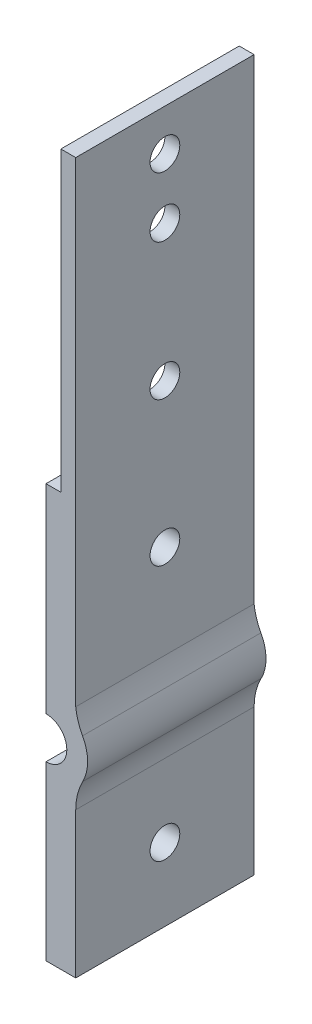
ISO-10303-21;
HEADER;
FILE_DESCRIPTION(('STEP AP214'),'2;1');
FILE_NAME('part.step','',(''),(''),'','','');
FILE_SCHEMA(('AUTOMOTIVE_DESIGN { 1 0 10303 214 1 1 1 1 }'));
ENDSEC;
DATA;
#1=APPLICATION_CONTEXT('core data for automotive mechanical design processes');
#2=APPLICATION_PROTOCOL_DEFINITION('international standard','automotive_design',2000,#1);
#3=PRODUCT_CONTEXT('',#1,'mechanical');
#4=PRODUCT('Part','Part','',(#3));
#5=PRODUCT_RELATED_PRODUCT_CATEGORY('part','',(#4));
#6=PRODUCT_DEFINITION_FORMATION('','',#4);
#7=PRODUCT_DEFINITION_CONTEXT('part definition',#1,'design');
#8=PRODUCT_DEFINITION('design','',#6,#7);
#9=PRODUCT_DEFINITION_SHAPE('','',#8);
#10=(LENGTH_UNIT() NAMED_UNIT(*) SI_UNIT(.MILLI.,.METRE.));
#11=(NAMED_UNIT(*) PLANE_ANGLE_UNIT() SI_UNIT($,.RADIAN.));
#12=(NAMED_UNIT(*) SI_UNIT($,.STERADIAN.) SOLID_ANGLE_UNIT());
#13=UNCERTAINTY_MEASURE_WITH_UNIT(LENGTH_MEASURE(1.E-05),#10,'distance_accuracy_value','');
#14=(GEOMETRIC_REPRESENTATION_CONTEXT(3) GLOBAL_UNCERTAINTY_ASSIGNED_CONTEXT((#13)) GLOBAL_UNIT_ASSIGNED_CONTEXT((#10,
#11,#12)) REPRESENTATION_CONTEXT('',''));
#15=CARTESIAN_POINT('',(0.,0.,0.));
#16=DIRECTION('',(0.,0.,1.));
#17=DIRECTION('',(1.,0.,0.));
#18=AXIS2_PLACEMENT_3D('',#15,#16,#17);
#19=CARTESIAN_POINT('',(0.,0.,30.));
#20=DIRECTION('',(0.,0.,-1.));
#21=DIRECTION('',(-1.,0.,0.));
#22=AXIS2_PLACEMENT_3D('',#19,#20,#21);
#23=CYLINDRICAL_SURFACE('',#22,7.);
#24=CARTESIAN_POINT('',(0.,0.,30.));
#25=DIRECTION('',(0.,0.,1.));
#26=DIRECTION('',(1.,0.,0.));
#27=AXIS2_PLACEMENT_3D('',#24,#25,#26);
#28=CIRCLE('',#27,7.);
#29=CARTESIAN_POINT('',(6.17647058823529,-3.29411764705882,30.));
#30=VERTEX_POINT('',#29);
#31=CARTESIAN_POINT('',(6.14730099509646,3.34823692048309,30.));
#32=VERTEX_POINT('',#31);
#33=EDGE_CURVE('E179',#30,#32,#28,.T.);
#34=ORIENTED_EDGE('',*,*,#33,.F.);
#35=DIRECTION('',(0.,0.,-1.));
#36=VECTOR('',#35,1.);
#37=CARTESIAN_POINT('',(6.17647058823529,-3.29411764705882,30.));
#38=LINE('',#37,#36);
#39=CARTESIAN_POINT('',(6.17647058823529,-3.29411764705882,0.));
#40=VERTEX_POINT('',#39);
#41=EDGE_CURVE('E195',#30,#40,#38,.T.);
#42=ORIENTED_EDGE('',*,*,#41,.T.);
#43=CARTESIAN_POINT('',(0.,0.,0.));
#44=DIRECTION('',(0.,0.,1.));
#45=DIRECTION('',(1.,0.,0.));
#46=AXIS2_PLACEMENT_3D('',#43,#44,#45);
#47=CIRCLE('',#46,7.);
#48=CARTESIAN_POINT('',(6.14730099509646,3.34823692048309,0.));
#49=VERTEX_POINT('',#48);
#50=EDGE_CURVE('E177',#40,#49,#47,.T.);
#51=ORIENTED_EDGE('',*,*,#50,.T.);
#52=DIRECTION('',(0.,0.,-1.));
#53=VECTOR('',#52,1.);
#54=CARTESIAN_POINT('',(6.14730099509646,3.34823692048309,30.));
#55=LINE('',#54,#53);
#56=EDGE_CURVE('E184',#49,#32,#55,.F.);
#57=ORIENTED_EDGE('',*,*,#56,.T.);
#58=EDGE_LOOP('',(#34,#42,#51,#57));
#59=FACE_BOUND('',#58,.T.);
#60=ADVANCED_FACE('F38',(#59),#23,.T.);
#61=CARTESIAN_POINT('',(0.,0.,30.));
#62=DIRECTION('',(0.,0.,1.));
#63=DIRECTION('',(1.,0.,0.));
#64=AXIS2_PLACEMENT_3D('',#61,#62,#63);
#65=PLANE('',#64);
#66=DIRECTION('',(1.,0.,0.));
#67=VECTOR('',#66,1.);
#68=CARTESIAN_POINT('',(0.,37.,30.));
#69=LINE('',#68,#67);
#70=CARTESIAN_POINT('',(0.,37.,30.));
#71=VERTEX_POINT('',#70);
#72=CARTESIAN_POINT('',(2.49999999999999,37.,30.));
#73=VERTEX_POINT('',#72);
#74=EDGE_CURVE('E237',#71,#73,#69,.T.);
#75=ORIENTED_EDGE('',*,*,#74,.F.);
#76=DIRECTION('',(0.,-1.,0.));
#77=VECTOR('',#76,1.);
#78=CARTESIAN_POINT('',(0.,9.15193033352163,30.));
#79=LINE('',#78,#77);
#80=CARTESIAN_POINT('',(0.,3.5,30.));
#81=VERTEX_POINT('',#80);
#82=EDGE_CURVE('E173',#71,#81,#79,.T.);
#83=ORIENTED_EDGE('',*,*,#82,.T.);
#84=CARTESIAN_POINT('',(0.,0.,30.));
#85=DIRECTION('',(0.,0.,1.));
#86=DIRECTION('',(1.,0.,0.));
#87=AXIS2_PLACEMENT_3D('',#84,#85,#86);
#88=CIRCLE('',#87,3.5);
#89=CARTESIAN_POINT('',(0.,-3.5,30.));
#90=VERTEX_POINT('',#89);
#91=EDGE_CURVE('E248',#90,#81,#88,.T.);
#92=ORIENTED_EDGE('',*,*,#91,.F.);
#93=DIRECTION('',(0.,-1.,0.));
#94=VECTOR('',#93,1.);
#95=CARTESIAN_POINT('',(0.,7.,30.));
#96=LINE('',#95,#94);
#97=CARTESIAN_POINT('',(0.,-32.5,30.));
#98=VERTEX_POINT('',#97);
#99=EDGE_CURVE('E269',#90,#98,#96,.T.);
#100=ORIENTED_EDGE('',*,*,#99,.T.);
#101=DIRECTION('',(-1.,0.,0.));
#102=VECTOR('',#101,1.);
#103=CARTESIAN_POINT('',(5.,-32.5,30.));
#104=LINE('',#103,#102);
#105=CARTESIAN_POINT('',(5.,-32.5,30.));
#106=VERTEX_POINT('',#105);
#107=EDGE_CURVE('E264',#106,#98,#104,.T.);
#108=ORIENTED_EDGE('',*,*,#107,.F.);
#109=DIRECTION('',(0.,1.,0.));
#110=VECTOR('',#109,1.);
#111=CARTESIAN_POINT('',(5.,-2.5,30.));
#112=LINE('',#111,#110);
#113=CARTESIAN_POINT('',(5.,-8.,30.));
#114=VERTEX_POINT('',#113);
#115=EDGE_CURVE('E222',#106,#114,#112,.T.);
#116=ORIENTED_EDGE('',*,*,#115,.T.);
#117=CARTESIAN_POINT('',(15.,-8.,30.));
#118=DIRECTION('',(0.,0.,1.));
#119=DIRECTION('',(1.,0.,0.));
#120=AXIS2_PLACEMENT_3D('',#117,#118,#119);
#121=CIRCLE('',#120,10.);
#122=EDGE_CURVE('E197',#114,#30,#121,.F.);
#123=ORIENTED_EDGE('',*,*,#122,.T.);
#124=ORIENTED_EDGE('',*,*,#33,.T.);
#125=CARTESIAN_POINT('',(14.92915955952,8.13143252117322,30.));
#126=DIRECTION('',(0.,0.,1.));
#127=DIRECTION('',(1.,0.,0.));
#128=AXIS2_PLACEMENT_3D('',#125,#126,#127);
#129=CIRCLE('',#128,10.);
#130=CARTESIAN_POINT('',(4.99337270341081,7.00000000000001,30.));
#131=VERTEX_POINT('',#130);
#132=EDGE_CURVE('E187',#32,#131,#129,.F.);
#133=ORIENTED_EDGE('',*,*,#132,.T.);
#134=DIRECTION('',(1.,0.,0.));
#135=VECTOR('',#134,1.);
#136=CARTESIAN_POINT('',(0.,7.,30.));
#137=LINE('',#136,#135);
#138=CARTESIAN_POINT('',(5.,7.00000000000001,30.));
#139=VERTEX_POINT('',#138);
#140=EDGE_CURVE('E165',#131,#139,#137,.T.);
#141=ORIENTED_EDGE('',*,*,#140,.T.);
#142=DIRECTION('',(0.,1.,0.));
#143=VECTOR('',#142,1.);
#144=CARTESIAN_POINT('',(5.,7.00000000000001,30.));
#145=LINE('',#144,#143);
#146=CARTESIAN_POINT('',(5.,87.,30.));
#147=VERTEX_POINT('',#146);
#148=EDGE_CURVE('E167',#139,#147,#145,.T.);
#149=ORIENTED_EDGE('',*,*,#148,.T.);
#150=DIRECTION('',(-1.,0.,0.));
#151=VECTOR('',#150,1.);
#152=CARTESIAN_POINT('',(0.,87.,30.));
#153=LINE('',#152,#151);
#154=CARTESIAN_POINT('',(2.5,87.,30.));
#155=VERTEX_POINT('',#154);
#156=EDGE_CURVE('E171',#147,#155,#153,.T.);
#157=ORIENTED_EDGE('',*,*,#156,.T.);
#158=DIRECTION('',(0.,1.,0.));
#159=VECTOR('',#158,1.);
#160=CARTESIAN_POINT('',(2.49999999999999,0.,30.));
#161=LINE('',#160,#159);
#162=EDGE_CURVE('E54',#73,#155,#161,.T.);
#163=ORIENTED_EDGE('',*,*,#162,.F.);
#164=EDGE_LOOP('',(#75,#83,#92,#100,#108,#116,#123,#124,#133,#141,#149,#157,#163));
#165=FACE_BOUND('',#164,.T.);
#166=ADVANCED_FACE('F220',(#165),#65,.T.);
#167=CARTESIAN_POINT('',(0.,0.,0.));
#168=DIRECTION('',(0.,0.,1.));
#169=DIRECTION('',(1.,0.,0.));
#170=AXIS2_PLACEMENT_3D('',#167,#168,#169);
#171=PLANE('',#170);
#172=DIRECTION('',(0.,-1.,0.));
#173=VECTOR('',#172,1.);
#174=CARTESIAN_POINT('',(0.,9.15193033352163,0.));
#175=LINE('',#174,#173);
#176=CARTESIAN_POINT('',(0.,37.,0.));
#177=VERTEX_POINT('',#176);
#178=CARTESIAN_POINT('',(0.,3.5,0.));
#179=VERTEX_POINT('',#178);
#180=EDGE_CURVE('E175',#177,#179,#175,.T.);
#181=ORIENTED_EDGE('',*,*,#180,.F.);
#182=DIRECTION('',(-1.,0.,0.));
#183=VECTOR('',#182,1.);
#184=CARTESIAN_POINT('',(0.,37.,0.));
#185=LINE('',#184,#183);
#186=CARTESIAN_POINT('',(2.49999999999999,37.,0.));
#187=VERTEX_POINT('',#186);
#188=EDGE_CURVE('E144',#187,#177,#185,.T.);
#189=ORIENTED_EDGE('',*,*,#188,.F.);
#190=DIRECTION('',(0.,-1.,0.));
#191=VECTOR('',#190,1.);
#192=CARTESIAN_POINT('',(2.5,87.,0.));
#193=LINE('',#192,#191);
#194=CARTESIAN_POINT('',(2.5,87.,0.));
#195=VERTEX_POINT('',#194);
#196=EDGE_CURVE('E137',#195,#187,#193,.T.);
#197=ORIENTED_EDGE('',*,*,#196,.F.);
#198=DIRECTION('',(-1.,0.,0.));
#199=VECTOR('',#198,1.);
#200=CARTESIAN_POINT('',(0.,87.,0.));
#201=LINE('',#200,#199);
#202=CARTESIAN_POINT('',(5.,87.,0.));
#203=VERTEX_POINT('',#202);
#204=EDGE_CURVE('E151',#203,#195,#201,.T.);
#205=ORIENTED_EDGE('',*,*,#204,.F.);
#206=DIRECTION('',(0.,1.,0.));
#207=VECTOR('',#206,1.);
#208=CARTESIAN_POINT('',(5.,7.00000000000001,0.));
#209=LINE('',#208,#207);
#210=CARTESIAN_POINT('',(5.,7.00000000000001,0.));
#211=VERTEX_POINT('',#210);
#212=EDGE_CURVE('E157',#211,#203,#209,.T.);
#213=ORIENTED_EDGE('',*,*,#212,.F.);
#214=DIRECTION('',(1.,0.,0.));
#215=VECTOR('',#214,1.);
#216=CARTESIAN_POINT('',(0.,7.,0.));
#217=LINE('',#216,#215);
#218=CARTESIAN_POINT('',(4.99337270341081,7.00000000000001,0.));
#219=VERTEX_POINT('',#218);
#220=EDGE_CURVE('E161',#219,#211,#217,.T.);
#221=ORIENTED_EDGE('',*,*,#220,.F.);
#222=CARTESIAN_POINT('',(14.92915955952,8.13143252117322,0.));
#223=DIRECTION('',(0.,0.,1.));
#224=DIRECTION('',(1.,0.,0.));
#225=AXIS2_PLACEMENT_3D('',#222,#223,#224);
#226=CIRCLE('',#225,10.);
#227=EDGE_CURVE('E189',#219,#49,#226,.T.);
#228=ORIENTED_EDGE('',*,*,#227,.T.);
#229=ORIENTED_EDGE('',*,*,#50,.F.);
#230=CARTESIAN_POINT('',(15.,-8.,0.));
#231=DIRECTION('',(0.,0.,1.));
#232=DIRECTION('',(1.,0.,0.));
#233=AXIS2_PLACEMENT_3D('',#230,#231,#232);
#234=CIRCLE('',#233,10.);
#235=CARTESIAN_POINT('',(5.,-8.,0.));
#236=VERTEX_POINT('',#235);
#237=EDGE_CURVE('E47',#40,#236,#234,.T.);
#238=ORIENTED_EDGE('',*,*,#237,.T.);
#239=DIRECTION('',(0.,-1.,0.));
#240=VECTOR('',#239,1.);
#241=CARTESIAN_POINT('',(5.,-2.5,0.));
#242=LINE('',#241,#240);
#243=CARTESIAN_POINT('',(5.,-32.5,0.));
#244=VERTEX_POINT('',#243);
#245=EDGE_CURVE('E203',#236,#244,#242,.T.);
#246=ORIENTED_EDGE('',*,*,#245,.T.);
#247=DIRECTION('',(-1.,0.,0.));
#248=VECTOR('',#247,1.);
#249=CARTESIAN_POINT('',(5.,-32.5,0.));
#250=LINE('',#249,#248);
#251=CARTESIAN_POINT('',(0.,-32.5,0.));
#252=VERTEX_POINT('',#251);
#253=EDGE_CURVE('E261',#244,#252,#250,.T.);
#254=ORIENTED_EDGE('',*,*,#253,.T.);
#255=DIRECTION('',(0.,-1.,0.));
#256=VECTOR('',#255,1.);
#257=CARTESIAN_POINT('',(0.,7.,0.));
#258=LINE('',#257,#256);
#259=CARTESIAN_POINT('',(0.,-3.5,0.));
#260=VERTEX_POINT('',#259);
#261=EDGE_CURVE('E267',#260,#252,#258,.T.);
#262=ORIENTED_EDGE('',*,*,#261,.F.);
#263=CARTESIAN_POINT('',(0.,0.,0.));
#264=DIRECTION('',(0.,0.,-1.));
#265=DIRECTION('',(-1.,0.,0.));
#266=AXIS2_PLACEMENT_3D('',#263,#264,#265);
#267=CIRCLE('',#266,3.5);
#268=EDGE_CURVE('E62',#179,#260,#267,.T.);
#269=ORIENTED_EDGE('',*,*,#268,.F.);
#270=EDGE_LOOP('',(#181,#189,#197,#205,#213,#221,#228,#229,#238,#246,#254,#262,#269));
#271=FACE_BOUND('',#270,.T.);
#272=ADVANCED_FACE('F149',(#271),#171,.F.);
#273=CARTESIAN_POINT('',(0.,9.15193033352163,0.));
#274=DIRECTION('',(-1.,0.,0.));
#275=DIRECTION('',(0.,0.,1.));
#276=AXIS2_PLACEMENT_3D('',#273,#274,#275);
#277=PLANE('',#276);
#278=DIRECTION('',(0.,0.,-1.));
#279=VECTOR('',#278,1.);
#280=CARTESIAN_POINT('',(0.,37.,50.));
#281=LINE('',#280,#279);
#282=EDGE_CURVE('E357',#71,#177,#281,.T.);
#283=ORIENTED_EDGE('',*,*,#282,.T.);
#284=ORIENTED_EDGE('',*,*,#180,.T.);
#285=DIRECTION('',(0.,0.,-1.));
#286=VECTOR('',#285,1.);
#287=CARTESIAN_POINT('',(0.,3.5,45.));
#288=LINE('',#287,#286);
#289=EDGE_CURVE('E251',#81,#179,#288,.T.);
#290=ORIENTED_EDGE('',*,*,#289,.F.);
#291=ORIENTED_EDGE('',*,*,#82,.F.);
#292=EDGE_LOOP('',(#283,#284,#290,#291));
#293=FACE_BOUND('',#292,.T.);
#294=CARTESIAN_POINT('',(0.,22.7617456939991,15.));
#295=DIRECTION('',(-1.,0.,0.));
#296=DIRECTION('',(0.,0.,1.));
#297=AXIS2_PLACEMENT_3D('',#294,#295,#296);
#298=CIRCLE('',#297,2.5);
#299=CARTESIAN_POINT('',(0.,22.7617456939991,17.5));
#300=VERTEX_POINT('',#299);
#301=EDGE_CURVE('E168',#300,#300,#298,.T.);
#302=ORIENTED_EDGE('',*,*,#301,.F.);
#303=EDGE_LOOP('',(#302));
#304=FACE_BOUND('',#303,.T.);
#305=ADVANCED_FACE('F290',(#293,#304),#277,.T.);
#306=CARTESIAN_POINT('',(0.,87.,0.));
#307=DIRECTION('',(0.,1.,0.));
#308=DIRECTION('',(0.,0.,1.));
#309=AXIS2_PLACEMENT_3D('',#306,#307,#308);
#310=PLANE('',#309);
#311=DIRECTION('',(0.,0.,-1.));
#312=VECTOR('',#311,1.);
#313=CARTESIAN_POINT('',(2.5,87.,50.));
#314=LINE('',#313,#312);
#315=EDGE_CURVE('E133',#155,#195,#314,.T.);
#316=ORIENTED_EDGE('',*,*,#315,.F.);
#317=ORIENTED_EDGE('',*,*,#156,.F.);
#318=DIRECTION('',(0.,0.,1.));
#319=VECTOR('',#318,1.);
#320=CARTESIAN_POINT('',(5.,87.,0.));
#321=LINE('',#320,#319);
#322=EDGE_CURVE('E154',#203,#147,#321,.T.);
#323=ORIENTED_EDGE('',*,*,#322,.F.);
#324=ORIENTED_EDGE('',*,*,#204,.T.);
#325=EDGE_LOOP('',(#316,#317,#323,#324));
#326=FACE_BOUND('',#325,.T.);
#327=ADVANCED_FACE('F153',(#326),#310,.T.);
#328=CARTESIAN_POINT('',(5.,7.00000000000001,0.));
#329=DIRECTION('',(1.,0.,0.));
#330=DIRECTION('',(0.,0.,-1.));
#331=AXIS2_PLACEMENT_3D('',#328,#329,#330);
#332=PLANE('',#331);
#333=CARTESIAN_POINT('',(5.,22.7617456939991,15.));
#334=DIRECTION('',(1.,0.,0.));
#335=DIRECTION('',(0.,0.,-1.));
#336=AXIS2_PLACEMENT_3D('',#333,#334,#335);
#337=CIRCLE('',#336,2.5);
#338=CARTESIAN_POINT('',(5.,22.7617456939991,12.5));
#339=VERTEX_POINT('',#338);
#340=EDGE_CURVE('E273',#339,#339,#337,.T.);
#341=ORIENTED_EDGE('',*,*,#340,.F.);
#342=EDGE_LOOP('',(#341));
#343=FACE_BOUND('',#342,.T.);
#344=CARTESIAN_POINT('',(5.,47.,15.));
#345=DIRECTION('',(1.,0.,0.));
#346=DIRECTION('',(0.,0.,-1.));
#347=AXIS2_PLACEMENT_3D('',#344,#345,#346);
#348=CIRCLE('',#347,2.5);
#349=CARTESIAN_POINT('',(5.,47.,12.5));
#350=VERTEX_POINT('',#349);
#351=EDGE_CURVE('E276',#350,#350,#348,.T.);
#352=ORIENTED_EDGE('',*,*,#351,.F.);
#353=EDGE_LOOP('',(#352));
#354=FACE_BOUND('',#353,.T.);
#355=CARTESIAN_POINT('',(5.,69.9539247826708,15.));
#356=DIRECTION('',(1.,0.,0.));
#357=DIRECTION('',(0.,0.,-1.));
#358=AXIS2_PLACEMENT_3D('',#355,#356,#357);
#359=CIRCLE('',#358,2.5);
#360=CARTESIAN_POINT('',(5.,69.9539247826708,12.5));
#361=VERTEX_POINT('',#360);
#362=EDGE_CURVE('E279',#361,#361,#359,.T.);
#363=ORIENTED_EDGE('',*,*,#362,.F.);
#364=EDGE_LOOP('',(#363));
#365=FACE_BOUND('',#364,.T.);
#366=CARTESIAN_POINT('',(5.,80.0478075321922,15.));
#367=DIRECTION('',(1.,0.,0.));
#368=DIRECTION('',(0.,0.,-1.));
#369=AXIS2_PLACEMENT_3D('',#366,#367,#368);
#370=CIRCLE('',#369,2.5);
#371=CARTESIAN_POINT('',(5.,80.0478075321922,12.5));
#372=VERTEX_POINT('',#371);
#373=EDGE_CURVE('E271',#372,#372,#370,.T.);
#374=ORIENTED_EDGE('',*,*,#373,.F.);
#375=EDGE_LOOP('',(#374));
#376=FACE_BOUND('',#375,.T.);
#377=ORIENTED_EDGE('',*,*,#148,.F.);
#378=DIRECTION('',(0.,0.,1.));
#379=VECTOR('',#378,1.);
#380=CARTESIAN_POINT('',(5.,7.00000000000001,0.));
#381=LINE('',#380,#379);
#382=EDGE_CURVE('E156',#211,#139,#381,.T.);
#383=ORIENTED_EDGE('',*,*,#382,.F.);
#384=ORIENTED_EDGE('',*,*,#212,.T.);
#385=ORIENTED_EDGE('',*,*,#322,.T.);
#386=EDGE_LOOP('',(#377,#383,#384,#385));
#387=FACE_BOUND('',#386,.T.);
#388=ADVANCED_FACE('F236',(#343,#354,#365,#376,#387),#332,.T.);
#389=CARTESIAN_POINT('',(0.,7.,0.));
#390=DIRECTION('',(0.,-1.,0.));
#391=DIRECTION('',(1.,0.,0.));
#392=AXIS2_PLACEMENT_3D('',#389,#390,#391);
#393=PLANE('',#392);
#394=ORIENTED_EDGE('',*,*,#140,.F.);
#395=DIRECTION('',(0.,0.,-1.));
#396=VECTOR('',#395,1.);
#397=CARTESIAN_POINT('',(4.99337270341081,7.00000000000001,0.));
#398=LINE('',#397,#396);
#399=EDGE_CURVE('E181',#131,#219,#398,.T.);
#400=ORIENTED_EDGE('',*,*,#399,.T.);
#401=ORIENTED_EDGE('',*,*,#220,.T.);
#402=ORIENTED_EDGE('',*,*,#382,.T.);
#403=EDGE_LOOP('',(#394,#400,#401,#402));
#404=FACE_BOUND('',#403,.T.);
#405=ADVANCED_FACE('F231',(#404),#393,.T.);
#406=CARTESIAN_POINT('',(14.92915955952,8.13143252117322,0.));
#407=DIRECTION('',(0.,0.,-1.));
#408=DIRECTION('',(-1.,0.,0.));
#409=AXIS2_PLACEMENT_3D('',#406,#407,#408);
#410=CYLINDRICAL_SURFACE('',#409,10.);
#411=ORIENTED_EDGE('',*,*,#227,.F.);
#412=ORIENTED_EDGE('',*,*,#399,.F.);
#413=ORIENTED_EDGE('',*,*,#132,.F.);
#414=ORIENTED_EDGE('',*,*,#56,.F.);
#415=EDGE_LOOP('',(#411,#412,#413,#414));
#416=FACE_BOUND('',#415,.T.);
#417=ADVANCED_FACE('F227',(#416),#410,.F.);
#418=CARTESIAN_POINT('',(-25.,80.0478075321922,15.));
#419=DIRECTION('',(1.,0.,0.));
#420=DIRECTION('',(0.,0.,-1.));
#421=AXIS2_PLACEMENT_3D('',#418,#419,#420);
#422=CYLINDRICAL_SURFACE('',#421,2.5);
#423=CARTESIAN_POINT('',(2.5,80.0478075321922,15.));
#424=DIRECTION('',(1.,0.,0.));
#425=DIRECTION('',(0.,1.,0.));
#426=AXIS2_PLACEMENT_3D('',#423,#424,#425);
#427=CIRCLE('',#426,2.5);
#428=CARTESIAN_POINT('',(2.5,82.5478075321922,15.));
#429=VERTEX_POINT('',#428);
#430=EDGE_CURVE('E239',#429,#429,#427,.F.);
#431=ORIENTED_EDGE('',*,*,#430,.T.);
#432=EDGE_LOOP('',(#431));
#433=FACE_BOUND('',#432,.T.);
#434=ORIENTED_EDGE('',*,*,#373,.T.);
#435=EDGE_LOOP('',(#434));
#436=FACE_BOUND('',#435,.T.);
#437=ADVANCED_FACE('F309',(#433,#436),#422,.F.);
#438=CARTESIAN_POINT('',(-25.,69.9539247826708,15.));
#439=DIRECTION('',(1.,0.,0.));
#440=DIRECTION('',(0.,0.,-1.));
#441=AXIS2_PLACEMENT_3D('',#438,#439,#440);
#442=CYLINDRICAL_SURFACE('',#441,2.5);
#443=CARTESIAN_POINT('',(2.5,69.9539247826708,15.));
#444=DIRECTION('',(1.,0.,0.));
#445=DIRECTION('',(0.,1.,0.));
#446=AXIS2_PLACEMENT_3D('',#443,#444,#445);
#447=CIRCLE('',#446,2.5);
#448=CARTESIAN_POINT('',(2.5,72.4539247826708,15.));
#449=VERTEX_POINT('',#448);
#450=EDGE_CURVE('E243',#449,#449,#447,.F.);
#451=ORIENTED_EDGE('',*,*,#450,.T.);
#452=EDGE_LOOP('',(#451));
#453=FACE_BOUND('',#452,.T.);
#454=ORIENTED_EDGE('',*,*,#362,.T.);
#455=EDGE_LOOP('',(#454));
#456=FACE_BOUND('',#455,.T.);
#457=ADVANCED_FACE('F314',(#453,#456),#442,.F.);
#458=CARTESIAN_POINT('',(-25.,47.,15.));
#459=DIRECTION('',(1.,0.,0.));
#460=DIRECTION('',(0.,0.,-1.));
#461=AXIS2_PLACEMENT_3D('',#458,#459,#460);
#462=CYLINDRICAL_SURFACE('',#461,2.5);
#463=CARTESIAN_POINT('',(2.49999999999999,47.,15.));
#464=DIRECTION('',(1.,0.,0.));
#465=DIRECTION('',(0.,1.,0.));
#466=AXIS2_PLACEMENT_3D('',#463,#464,#465);
#467=CIRCLE('',#466,2.5);
#468=CARTESIAN_POINT('',(2.49999999999999,49.5,15.));
#469=VERTEX_POINT('',#468);
#470=EDGE_CURVE('E42',#469,#469,#467,.F.);
#471=ORIENTED_EDGE('',*,*,#470,.T.);
#472=EDGE_LOOP('',(#471));
#473=FACE_BOUND('',#472,.T.);
#474=ORIENTED_EDGE('',*,*,#351,.T.);
#475=EDGE_LOOP('',(#474));
#476=FACE_BOUND('',#475,.T.);
#477=ADVANCED_FACE('F325',(#473,#476),#462,.F.);
#478=CARTESIAN_POINT('',(-25.,22.7617456939991,15.));
#479=DIRECTION('',(1.,0.,0.));
#480=DIRECTION('',(0.,0.,-1.));
#481=AXIS2_PLACEMENT_3D('',#478,#479,#480);
#482=CYLINDRICAL_SURFACE('',#481,2.5);
#483=ORIENTED_EDGE('',*,*,#301,.T.);
#484=EDGE_LOOP('',(#483));
#485=FACE_BOUND('',#484,.T.);
#486=ORIENTED_EDGE('',*,*,#340,.T.);
#487=EDGE_LOOP('',(#486));
#488=FACE_BOUND('',#487,.T.);
#489=ADVANCED_FACE('F287',(#485,#488),#482,.F.);
#490=CARTESIAN_POINT('',(0.,7.,30.));
#491=DIRECTION('',(1.,0.,0.));
#492=DIRECTION('',(0.,0.,-1.));
#493=AXIS2_PLACEMENT_3D('',#490,#491,#492);
#494=PLANE('',#493);
#495=CARTESIAN_POINT('',(0.,-20.25,15.));
#496=DIRECTION('',(1.,0.,0.));
#497=DIRECTION('',(0.,0.,-1.));
#498=AXIS2_PLACEMENT_3D('',#495,#496,#497);
#499=CIRCLE('',#498,2.5);
#500=CARTESIAN_POINT('',(0.,-20.25,12.5));
#501=VERTEX_POINT('',#500);
#502=EDGE_CURVE('E254',#501,#501,#499,.T.);
#503=ORIENTED_EDGE('',*,*,#502,.T.);
#504=EDGE_LOOP('',(#503));
#505=FACE_BOUND('',#504,.T.);
#506=ORIENTED_EDGE('',*,*,#99,.F.);
#507=DIRECTION('',(0.,0.,-1.));
#508=VECTOR('',#507,1.);
#509=CARTESIAN_POINT('',(0.,-3.5,45.));
#510=LINE('',#509,#508);
#511=EDGE_CURVE('E11',#90,#260,#510,.T.);
#512=ORIENTED_EDGE('',*,*,#511,.T.);
#513=ORIENTED_EDGE('',*,*,#261,.T.);
#514=DIRECTION('',(0.,0.,1.));
#515=VECTOR('',#514,1.);
#516=CARTESIAN_POINT('',(0.,-32.5,0.));
#517=LINE('',#516,#515);
#518=EDGE_CURVE('E215',#252,#98,#517,.T.);
#519=ORIENTED_EDGE('',*,*,#518,.T.);
#520=EDGE_LOOP('',(#506,#512,#513,#519));
#521=FACE_BOUND('',#520,.T.);
#522=ADVANCED_FACE('F332',(#505,#521),#494,.F.);
#523=CARTESIAN_POINT('',(5.,0.,0.));
#524=DIRECTION('',(-1.,0.,0.));
#525=DIRECTION('',(0.,0.,1.));
#526=AXIS2_PLACEMENT_3D('',#523,#524,#525);
#527=PLANE('',#526);
#528=CARTESIAN_POINT('',(5.,-20.25,15.));
#529=DIRECTION('',(1.,0.,0.));
#530=DIRECTION('',(0.,0.,-1.));
#531=AXIS2_PLACEMENT_3D('',#528,#529,#530);
#532=CIRCLE('',#531,2.5);
#533=CARTESIAN_POINT('',(5.,-20.25,12.5));
#534=VERTEX_POINT('',#533);
#535=EDGE_CURVE('E253',#534,#534,#532,.T.);
#536=ORIENTED_EDGE('',*,*,#535,.F.);
#537=EDGE_LOOP('',(#536));
#538=FACE_BOUND('',#537,.T.);
#539=ORIENTED_EDGE('',*,*,#245,.F.);
#540=DIRECTION('',(0.,0.,1.));
#541=VECTOR('',#540,1.);
#542=CARTESIAN_POINT('',(5.,-8.,30.));
#543=LINE('',#542,#541);
#544=EDGE_CURVE('E192',#236,#114,#543,.T.);
#545=ORIENTED_EDGE('',*,*,#544,.T.);
#546=ORIENTED_EDGE('',*,*,#115,.F.);
#547=DIRECTION('',(0.,0.,1.));
#548=VECTOR('',#547,1.);
#549=CARTESIAN_POINT('',(5.,-32.5,0.));
#550=LINE('',#549,#548);
#551=EDGE_CURVE('E214',#244,#106,#550,.T.);
#552=ORIENTED_EDGE('',*,*,#551,.F.);
#553=EDGE_LOOP('',(#539,#545,#546,#552));
#554=FACE_BOUND('',#553,.T.);
#555=ADVANCED_FACE('F210',(#538,#554),#527,.F.);
#556=CARTESIAN_POINT('',(5.,-32.5,0.));
#557=DIRECTION('',(0.,-1.,0.));
#558=DIRECTION('',(0.,0.,-1.));
#559=AXIS2_PLACEMENT_3D('',#556,#557,#558);
#560=PLANE('',#559);
#561=ORIENTED_EDGE('',*,*,#518,.F.);
#562=ORIENTED_EDGE('',*,*,#253,.F.);
#563=ORIENTED_EDGE('',*,*,#551,.T.);
#564=ORIENTED_EDGE('',*,*,#107,.T.);
#565=EDGE_LOOP('',(#561,#562,#563,#564));
#566=FACE_BOUND('',#565,.T.);
#567=ADVANCED_FACE('F336',(#566),#560,.T.);
#568=CARTESIAN_POINT('',(15.,-8.,30.));
#569=DIRECTION('',(0.,0.,-1.));
#570=DIRECTION('',(-1.,0.,0.));
#571=AXIS2_PLACEMENT_3D('',#568,#569,#570);
#572=CYLINDRICAL_SURFACE('',#571,10.);
#573=ORIENTED_EDGE('',*,*,#237,.F.);
#574=ORIENTED_EDGE('',*,*,#41,.F.);
#575=ORIENTED_EDGE('',*,*,#122,.F.);
#576=ORIENTED_EDGE('',*,*,#544,.F.);
#577=EDGE_LOOP('',(#573,#574,#575,#576));
#578=FACE_BOUND('',#577,.T.);
#579=ADVANCED_FACE('F40',(#578),#572,.F.);
#580=CARTESIAN_POINT('',(0.,-20.25,15.));
#581=DIRECTION('',(1.,0.,0.));
#582=DIRECTION('',(0.,0.,-1.));
#583=AXIS2_PLACEMENT_3D('',#580,#581,#582);
#584=CYLINDRICAL_SURFACE('',#583,2.5);
#585=ORIENTED_EDGE('',*,*,#502,.F.);
#586=EDGE_LOOP('',(#585));
#587=FACE_BOUND('',#586,.T.);
#588=ORIENTED_EDGE('',*,*,#535,.T.);
#589=EDGE_LOOP('',(#588));
#590=FACE_BOUND('',#589,.T.);
#591=ADVANCED_FACE('F343',(#587,#590),#584,.F.);
#592=CARTESIAN_POINT('',(0.,0.,45.));
#593=DIRECTION('',(0.,0.,-1.));
#594=DIRECTION('',(-1.,0.,0.));
#595=AXIS2_PLACEMENT_3D('',#592,#593,#594);
#596=CYLINDRICAL_SURFACE('',#595,3.5);
#597=ORIENTED_EDGE('',*,*,#289,.T.);
#598=ORIENTED_EDGE('',*,*,#268,.T.);
#599=ORIENTED_EDGE('',*,*,#511,.F.);
#600=ORIENTED_EDGE('',*,*,#91,.T.);
#601=EDGE_LOOP('',(#597,#598,#599,#600));
#602=FACE_BOUND('',#601,.T.);
#603=ADVANCED_FACE('F346',(#602),#596,.F.);
#604=CARTESIAN_POINT('',(2.5,87.,50.));
#605=DIRECTION('',(1.,0.,0.));
#606=DIRECTION('',(0.,1.,0.));
#607=AXIS2_PLACEMENT_3D('',#604,#605,#606);
#608=PLANE('',#607);
#609=ORIENTED_EDGE('',*,*,#162,.T.);
#610=ORIENTED_EDGE('',*,*,#315,.T.);
#611=ORIENTED_EDGE('',*,*,#196,.T.);
#612=DIRECTION('',(0.,0.,-1.));
#613=VECTOR('',#612,1.);
#614=CARTESIAN_POINT('',(2.49999999999999,37.,50.));
#615=LINE('',#614,#613);
#616=EDGE_CURVE('E143',#73,#187,#615,.T.);
#617=ORIENTED_EDGE('',*,*,#616,.F.);
#618=EDGE_LOOP('',(#609,#610,#611,#617));
#619=FACE_BOUND('',#618,.T.);
#620=ORIENTED_EDGE('',*,*,#450,.F.);
#621=EDGE_LOOP('',(#620));
#622=FACE_BOUND('',#621,.T.);
#623=ORIENTED_EDGE('',*,*,#470,.F.);
#624=EDGE_LOOP('',(#623));
#625=FACE_BOUND('',#624,.T.);
#626=ORIENTED_EDGE('',*,*,#430,.F.);
#627=EDGE_LOOP('',(#626));
#628=FACE_BOUND('',#627,.T.);
#629=ADVANCED_FACE('F135',(#619,#622,#625,#628),#608,.F.);
#630=CARTESIAN_POINT('',(0.,37.,50.));
#631=DIRECTION('',(0.,-1.,0.));
#632=DIRECTION('',(0.,0.,-1.));
#633=AXIS2_PLACEMENT_3D('',#630,#631,#632);
#634=PLANE('',#633);
#635=ORIENTED_EDGE('',*,*,#74,.T.);
#636=ORIENTED_EDGE('',*,*,#616,.T.);
#637=ORIENTED_EDGE('',*,*,#188,.T.);
#638=ORIENTED_EDGE('',*,*,#282,.F.);
#639=EDGE_LOOP('',(#635,#636,#637,#638));
#640=FACE_BOUND('',#639,.T.);
#641=ADVANCED_FACE('F352',(#640),#634,.F.);
#642=CLOSED_SHELL('',(#60,#166,#272,#305,#327,#388,#405,#417,#437,#457,#477,#489,#522,#555,#567,
#579,#591,#603,#629,#641));
#643=MANIFOLD_SOLID_BREP('B2',#642);
#644=ADVANCED_BREP_SHAPE_REPRESENTATION('',(#18,#643),#14);
#645=SHAPE_DEFINITION_REPRESENTATION(#9,#644);
ENDSEC;
END-ISO-10303-21;
